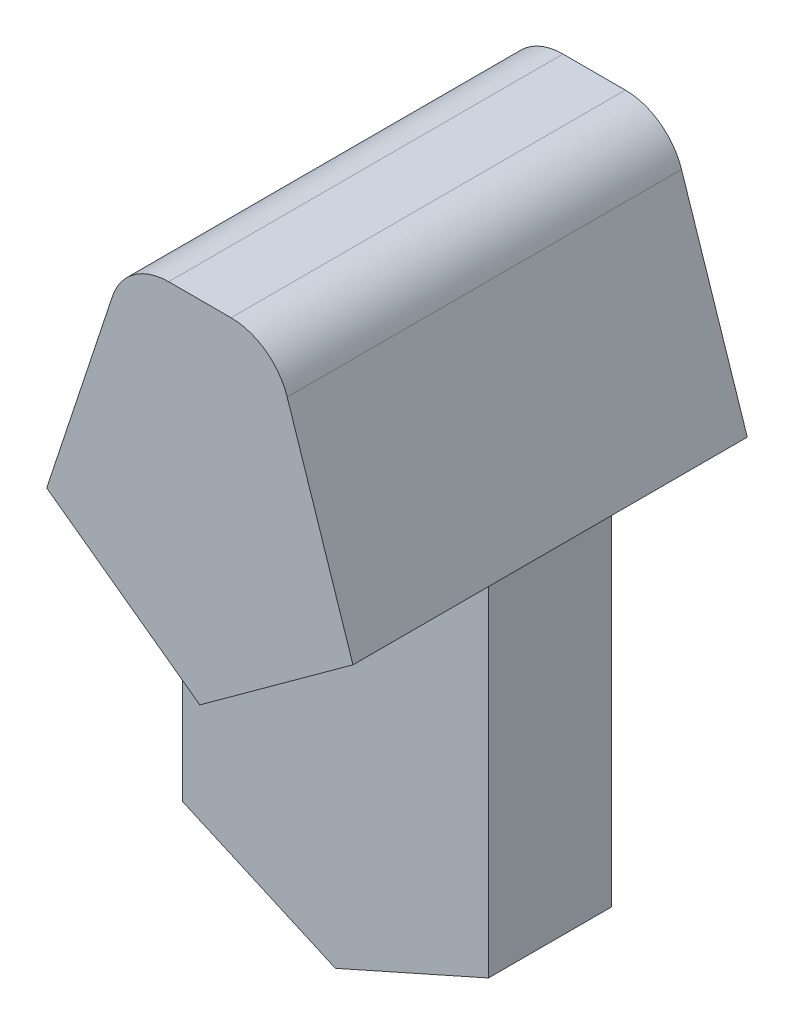
ISO-10303-21;
HEADER;
FILE_DESCRIPTION(('STEP AP214'),'2;1');
FILE_NAME('part.step','',(''),(''),'','','');
FILE_SCHEMA(('AUTOMOTIVE_DESIGN { 1 0 10303 214 1 1 1 1 }'));
ENDSEC;
DATA;
#1=APPLICATION_CONTEXT('core data for automotive mechanical design processes');
#2=APPLICATION_PROTOCOL_DEFINITION('international standard','automotive_design',2000,#1);
#3=PRODUCT_CONTEXT('',#1,'mechanical');
#4=PRODUCT('Part','Part','',(#3));
#5=PRODUCT_RELATED_PRODUCT_CATEGORY('part','',(#4));
#6=PRODUCT_DEFINITION_FORMATION('','',#4);
#7=PRODUCT_DEFINITION_CONTEXT('part definition',#1,'design');
#8=PRODUCT_DEFINITION('design','',#6,#7);
#9=PRODUCT_DEFINITION_SHAPE('','',#8);
#10=(LENGTH_UNIT() NAMED_UNIT(*) SI_UNIT(.MILLI.,.METRE.));
#11=(NAMED_UNIT(*) PLANE_ANGLE_UNIT() SI_UNIT($,.RADIAN.));
#12=(NAMED_UNIT(*) SI_UNIT($,.STERADIAN.) SOLID_ANGLE_UNIT());
#13=UNCERTAINTY_MEASURE_WITH_UNIT(LENGTH_MEASURE(1.E-05),#10,'distance_accuracy_value','');
#14=(GEOMETRIC_REPRESENTATION_CONTEXT(3) GLOBAL_UNCERTAINTY_ASSIGNED_CONTEXT((#13)) GLOBAL_UNIT_ASSIGNED_CONTEXT((#10,
#11,#12)) REPRESENTATION_CONTEXT('',''));
#15=CARTESIAN_POINT('',(0.,0.,0.));
#16=DIRECTION('',(0.,0.,1.));
#17=DIRECTION('',(1.,0.,0.));
#18=AXIS2_PLACEMENT_3D('',#15,#16,#17);
#19=CARTESIAN_POINT('',(0.,-9.525,0.));
#20=DIRECTION('',(0.,1.,0.));
#21=DIRECTION('',(-1.,0.,0.));
#22=AXIS2_PLACEMENT_3D('',#19,#20,#21);
#23=PLANE('',#22);
#24=DIRECTION('',(-1.,0.,0.));
#25=VECTOR('',#24,1.);
#26=CARTESIAN_POINT('',(2.03199999999995,-9.525,5.7912));
#27=LINE('',#26,#25);
#28=CARTESIAN_POINT('',(0.0117675977095557,-9.525,5.7912));
#29=VERTEX_POINT('',#28);
#30=CARTESIAN_POINT('',(-0.0117675977097005,-9.525,5.7912));
#31=VERTEX_POINT('',#30);
#32=EDGE_CURVE('E205',#29,#31,#27,.T.);
#33=ORIENTED_EDGE('',*,*,#32,.T.);
#34=DIRECTION('',(0.,0.,-1.));
#35=VECTOR('',#34,1.);
#36=CARTESIAN_POINT('',(-0.0117675977097005,-9.525,0.));
#37=LINE('',#36,#35);
#38=CARTESIAN_POINT('',(-0.0117675977097005,-9.525,4.365625));
#39=VERTEX_POINT('',#38);
#40=EDGE_CURVE('E364',#31,#39,#37,.T.);
#41=ORIENTED_EDGE('',*,*,#40,.T.);
#42=DIRECTION('',(1.,0.,0.));
#43=VECTOR('',#42,1.);
#44=CARTESIAN_POINT('',(-4.93176759770971,-9.52499999999997,4.365625));
#45=LINE('',#44,#43);
#46=CARTESIAN_POINT('',(0.0117675977095548,-9.525,4.365625));
#47=VERTEX_POINT('',#46);
#48=EDGE_CURVE('E253',#39,#47,#45,.T.);
#49=ORIENTED_EDGE('',*,*,#48,.T.);
#50=DIRECTION('',(0.,0.,1.));
#51=VECTOR('',#50,1.);
#52=CARTESIAN_POINT('',(0.011767597709555,-9.525,8.334375));
#53=LINE('',#52,#51);
#54=EDGE_CURVE('E370',#47,#29,#53,.T.);
#55=ORIENTED_EDGE('',*,*,#54,.T.);
#56=EDGE_LOOP('',(#33,#41,#49,#55));
#57=FACE_BOUND('',#56,.T.);
#58=ADVANCED_FACE('F41',(#57),#23,.F.);
#59=CARTESIAN_POINT('',(4.9317675977096,-7.33447486828204,8.334375));
#60=DIRECTION('',(0.406736643075792,-0.913545457642605,0.));
#61=DIRECTION('',(0.,0.,1.));
#62=AXIS2_PLACEMENT_3D('',#59,#60,#61);
#63=PLANE('',#62);
#64=DIRECTION('',(0.,0.,1.));
#65=VECTOR('',#64,1.);
#66=CARTESIAN_POINT('',(2.03199999999995,-8.62553458351056,8.334375));
#67=LINE('',#66,#65);
#68=CARTESIAN_POINT('',(2.03199999999995,-8.62553458351056,5.7912));
#69=VERTEX_POINT('',#68);
#70=CARTESIAN_POINT('',(2.03199999999995,-8.62553458351056,6.9088));
#71=VERTEX_POINT('',#70);
#72=EDGE_CURVE('E11',#69,#71,#67,.T.);
#73=ORIENTED_EDGE('',*,*,#72,.F.);
#74=DIRECTION('',(-0.913545457642605,-0.406736643075792,0.));
#75=VECTOR('',#74,1.);
#76=CARTESIAN_POINT('',(4.9317675977096,-7.33447486828204,5.7912));
#77=LINE('',#76,#75);
#78=EDGE_CURVE('E229',#69,#29,#77,.T.);
#79=ORIENTED_EDGE('',*,*,#78,.T.);
#80=ORIENTED_EDGE('',*,*,#54,.F.);
#81=DIRECTION('',(-0.913545457642605,-0.406736643075792,0.));
#82=VECTOR('',#81,1.);
#83=CARTESIAN_POINT('',(4.9317675977096,-7.33447486828204,4.365625));
#84=LINE('',#83,#82);
#85=CARTESIAN_POINT('',(4.9317675977096,-7.33447486828204,4.365625));
#86=VERTEX_POINT('',#85);
#87=EDGE_CURVE('E361',#86,#47,#84,.T.);
#88=ORIENTED_EDGE('',*,*,#87,.F.);
#89=DIRECTION('',(0.,0.,-1.));
#90=VECTOR('',#89,1.);
#91=CARTESIAN_POINT('',(4.9317675977096,-7.33447486828204,4.365625));
#92=LINE('',#91,#90);
#93=CARTESIAN_POINT('',(4.9317675977096,-7.33447486828204,8.334375));
#94=VERTEX_POINT('',#93);
#95=EDGE_CURVE('E354',#94,#86,#92,.T.);
#96=ORIENTED_EDGE('',*,*,#95,.F.);
#97=DIRECTION('',(0.913545457642605,0.406736643075792,0.));
#98=VECTOR('',#97,1.);
#99=CARTESIAN_POINT('',(-4.11393535143373,-11.3618813000206,8.334375));
#100=LINE('',#99,#98);
#101=CARTESIAN_POINT('',(0.0117675977095548,-9.525,8.334375));
#102=VERTEX_POINT('',#101);
#103=EDGE_CURVE('E377',#102,#94,#100,.T.);
#104=ORIENTED_EDGE('',*,*,#103,.F.);
#105=CARTESIAN_POINT('',(0.0117675977095557,-9.525,6.9088));
#106=VERTEX_POINT('',#105);
#107=EDGE_CURVE('E369',#106,#102,#53,.T.);
#108=ORIENTED_EDGE('',*,*,#107,.F.);
#109=DIRECTION('',(-0.913545457642605,-0.406736643075792,0.));
#110=VECTOR('',#109,1.);
#111=CARTESIAN_POINT('',(4.9317675977096,-7.33447486828204,6.9088));
#112=LINE('',#111,#110);
#113=EDGE_CURVE('E220',#71,#106,#112,.T.);
#114=ORIENTED_EDGE('',*,*,#113,.F.);
#115=EDGE_LOOP('',(#73,#79,#80,#88,#96,#104,#108,#114));
#116=FACE_BOUND('',#115,.T.);
#117=ADVANCED_FACE('F400',(#116),#63,.T.);
#118=CARTESIAN_POINT('',(-0.0117675977097005,-9.525,0.));
#119=DIRECTION('',(0.406736643075813,0.913545457642595,0.));
#120=DIRECTION('',(0.,0.,-1.));
#121=AXIS2_PLACEMENT_3D('',#118,#119,#120);
#122=PLANE('',#121);
#123=ORIENTED_EDGE('',*,*,#40,.F.);
#124=DIRECTION('',(0.913545457642595,-0.406736643075813,0.));
#125=VECTOR('',#124,1.);
#126=CARTESIAN_POINT('',(-0.0117675977097005,-9.525,5.7912));
#127=LINE('',#126,#125);
#128=CARTESIAN_POINT('',(-2.03200000000005,-8.62553458351053,5.7912));
#129=VERTEX_POINT('',#128);
#130=EDGE_CURVE('E51',#31,#129,#127,.F.);
#131=ORIENTED_EDGE('',*,*,#130,.T.);
#132=DIRECTION('',(0.,0.,-1.));
#133=VECTOR('',#132,1.);
#134=CARTESIAN_POINT('',(-2.03200000000005,-8.62553458351053,0.));
#135=LINE('',#134,#133);
#136=CARTESIAN_POINT('',(-2.03200000000005,-8.62553458351053,6.9088));
#137=VERTEX_POINT('',#136);
#138=EDGE_CURVE('E385',#129,#137,#135,.F.);
#139=ORIENTED_EDGE('',*,*,#138,.T.);
#140=DIRECTION('',(0.913545457642595,-0.406736643075813,0.));
#141=VECTOR('',#140,1.);
#142=CARTESIAN_POINT('',(-0.0117675977097005,-9.525,6.9088));
#143=LINE('',#142,#141);
#144=CARTESIAN_POINT('',(-0.0117675977097005,-9.525,6.9088));
#145=VERTEX_POINT('',#144);
#146=EDGE_CURVE('E382',#145,#137,#143,.F.);
#147=ORIENTED_EDGE('',*,*,#146,.F.);
#148=CARTESIAN_POINT('',(-0.0117675977097005,-9.525,8.334375));
#149=VERTEX_POINT('',#148);
#150=EDGE_CURVE('E365',#149,#145,#37,.T.);
#151=ORIENTED_EDGE('',*,*,#150,.F.);
#152=DIRECTION('',(-0.913545457642595,0.406736643075813,0.));
#153=VECTOR('',#152,1.);
#154=CARTESIAN_POINT('',(-4.11782888935246,-7.69686372932555,8.334375));
#155=LINE('',#154,#153);
#156=CARTESIAN_POINT('',(-4.9317675977097,-7.33447486828192,8.334375));
#157=VERTEX_POINT('',#156);
#158=EDGE_CURVE('E374',#157,#149,#155,.F.);
#159=ORIENTED_EDGE('',*,*,#158,.F.);
#160=DIRECTION('',(0.,0.,1.));
#161=VECTOR('',#160,1.);
#162=CARTESIAN_POINT('',(-4.9317675977097,-7.33447486828192,8.334375));
#163=LINE('',#162,#161);
#164=CARTESIAN_POINT('',(-4.9317675977097,-7.33447486828192,4.365625));
#165=VERTEX_POINT('',#164);
#166=EDGE_CURVE('E66',#165,#157,#163,.T.);
#167=ORIENTED_EDGE('',*,*,#166,.F.);
#168=DIRECTION('',(0.913545457642595,-0.406736643075813,0.));
#169=VECTOR('',#168,1.);
#170=CARTESIAN_POINT('',(-0.0117675977097005,-9.525,4.365625));
#171=LINE('',#170,#169);
#172=EDGE_CURVE('E358',#39,#165,#171,.F.);
#173=ORIENTED_EDGE('',*,*,#172,.F.);
#174=EDGE_LOOP('',(#123,#131,#139,#147,#151,#159,#167,#173));
#175=FACE_BOUND('',#174,.T.);
#176=ADVANCED_FACE('F44',(#175),#122,.F.);
#177=CARTESIAN_POINT('',(4.93176759770967,3.58313889797493,12.7));
#178=DIRECTION('',(-0.587785252292475,0.809016994374946,0.));
#179=DIRECTION('',(-0.809016994374946,-0.587785252292475,0.));
#180=AXIS2_PLACEMENT_3D('',#177,#178,#179);
#181=PLANE('',#180);
#182=DIRECTION('',(0.809016994374946,0.587785252292475,0.));
#183=VECTOR('',#182,1.);
#184=CARTESIAN_POINT('',(2.14682306618461,1.559758257686,4.365625));
#185=LINE('',#184,#183);
#186=CARTESIAN_POINT('',(0.,0.,4.365625));
#187=VERTEX_POINT('',#186);
#188=CARTESIAN_POINT('',(4.93176759770967,3.58313889797493,4.365625));
#189=VERTEX_POINT('',#188);
#190=EDGE_CURVE('E238',#187,#189,#185,.T.);
#191=ORIENTED_EDGE('',*,*,#190,.F.);
#192=DIRECTION('',(0.,0.,-1.));
#193=VECTOR('',#192,1.);
#194=CARTESIAN_POINT('',(0.,0.,12.7));
#195=LINE('',#194,#193);
#196=CARTESIAN_POINT('',(0.,0.,0.));
#197=VERTEX_POINT('',#196);
#198=EDGE_CURVE('E296',#187,#197,#195,.T.);
#199=ORIENTED_EDGE('',*,*,#198,.T.);
#200=DIRECTION('',(0.809016994374946,0.587785252292475,0.));
#201=VECTOR('',#200,1.);
#202=CARTESIAN_POINT('',(4.93176759770967,3.58313889797493,0.));
#203=LINE('',#202,#201);
#204=CARTESIAN_POINT('',(4.93176759770967,3.58313889797493,0.));
#205=VERTEX_POINT('',#204);
#206=EDGE_CURVE('E276',#197,#205,#203,.T.);
#207=ORIENTED_EDGE('',*,*,#206,.T.);
#208=DIRECTION('',(0.,0.,-1.));
#209=VECTOR('',#208,1.);
#210=CARTESIAN_POINT('',(4.93176759770967,3.58313889797493,12.7));
#211=LINE('',#210,#209);
#212=EDGE_CURVE('E323',#189,#205,#211,.T.);
#213=ORIENTED_EDGE('',*,*,#212,.F.);
#214=EDGE_LOOP('',(#191,#199,#207,#213));
#215=FACE_BOUND('',#214,.T.);
#216=ADVANCED_FACE('F482',(#215),#181,.F.);
#217=CARTESIAN_POINT('',(0.,0.,12.7));
#218=DIRECTION('',(0.587785252292475,0.809016994374946,0.));
#219=DIRECTION('',(-0.809016994374946,0.587785252292475,0.));
#220=AXIS2_PLACEMENT_3D('',#217,#218,#219);
#221=PLANE('',#220);
#222=DIRECTION('',(0.809016994374946,-0.587785252292475,0.));
#223=VECTOR('',#222,1.);
#224=CARTESIAN_POINT('',(-8.60259066389412,6.25014796834098,4.365625));
#225=LINE('',#224,#223);
#226=CARTESIAN_POINT('',(-4.93176759770962,3.58313889797489,4.365625));
#227=VERTEX_POINT('',#226);
#228=EDGE_CURVE('E234',#227,#187,#225,.T.);
#229=ORIENTED_EDGE('',*,*,#228,.F.);
#230=DIRECTION('',(0.,0.,-1.));
#231=VECTOR('',#230,1.);
#232=CARTESIAN_POINT('',(-4.93176759770967,3.58313889797493,12.7));
#233=LINE('',#232,#231);
#234=CARTESIAN_POINT('',(-4.93176759770967,3.58313889797493,0.));
#235=VERTEX_POINT('',#234);
#236=EDGE_CURVE('E318',#227,#235,#233,.T.);
#237=ORIENTED_EDGE('',*,*,#236,.T.);
#238=DIRECTION('',(0.809016994374946,-0.587785252292475,0.));
#239=VECTOR('',#238,1.);
#240=CARTESIAN_POINT('',(0.,0.,0.));
#241=LINE('',#240,#239);
#242=EDGE_CURVE('E282',#235,#197,#241,.T.);
#243=ORIENTED_EDGE('',*,*,#242,.T.);
#244=ORIENTED_EDGE('',*,*,#198,.F.);
#245=EDGE_LOOP('',(#229,#237,#243,#244));
#246=FACE_BOUND('',#245,.T.);
#247=ADVANCED_FACE('F484',(#246),#221,.F.);
#248=CARTESIAN_POINT('',(0.,0.,12.7));
#249=VERTEX_POINT('',#248);
#250=CARTESIAN_POINT('',(0.,0.,8.334375));
#251=VERTEX_POINT('',#250);
#252=EDGE_CURVE('E314',#249,#251,#195,.T.);
#253=ORIENTED_EDGE('',*,*,#252,.T.);
#254=DIRECTION('',(0.809016994374946,0.587785252292475,0.));
#255=VECTOR('',#254,1.);
#256=CARTESIAN_POINT('',(2.14682306618461,1.559758257686,8.334375));
#257=LINE('',#256,#255);
#258=CARTESIAN_POINT('',(4.93176759770967,3.58313889797493,8.334375));
#259=VERTEX_POINT('',#258);
#260=EDGE_CURVE('E249',#251,#259,#257,.T.);
#261=ORIENTED_EDGE('',*,*,#260,.T.);
#262=CARTESIAN_POINT('',(4.93176759770967,3.58313889797493,12.7));
#263=VERTEX_POINT('',#262);
#264=EDGE_CURVE('E324',#263,#259,#211,.T.);
#265=ORIENTED_EDGE('',*,*,#264,.F.);
#266=DIRECTION('',(0.809016994374946,0.587785252292475,0.));
#267=VECTOR('',#266,1.);
#268=CARTESIAN_POINT('',(4.93176759770967,3.58313889797493,12.7));
#269=LINE('',#268,#267);
#270=EDGE_CURVE('E277',#249,#263,#269,.T.);
#271=ORIENTED_EDGE('',*,*,#270,.F.);
#272=EDGE_LOOP('',(#253,#261,#265,#271));
#273=FACE_BOUND('',#272,.T.);
#274=ADVANCED_FACE('F492',(#273),#181,.F.);
#275=CARTESIAN_POINT('',(2.38125,11.3006024698859,12.7));
#276=DIRECTION('',(-0.949491089063853,-0.31379399578121,0.));
#277=DIRECTION('',(0.31379399578121,-0.949491089063853,0.));
#278=AXIS2_PLACEMENT_3D('',#275,#276,#277);
#279=PLANE('',#278);
#280=DIRECTION('',(-0.31379399578121,0.949491089063853,0.));
#281=VECTOR('',#280,1.);
#282=CARTESIAN_POINT('',(2.38125,11.3006024698859,0.));
#283=LINE('',#282,#281);
#284=CARTESIAN_POINT('',(2.8132693806251,9.99338003184913,0.));
#285=VERTEX_POINT('',#284);
#286=EDGE_CURVE('E300',#205,#285,#283,.T.);
#287=ORIENTED_EDGE('',*,*,#286,.T.);
#288=DIRECTION('',(0.,0.,-1.));
#289=VECTOR('',#288,1.);
#290=CARTESIAN_POINT('',(2.8132693806251,9.99338003184913,12.7));
#291=LINE('',#290,#289);
#292=CARTESIAN_POINT('',(2.8132693806251,9.99338003184913,12.7));
#293=VERTEX_POINT('',#292);
#294=EDGE_CURVE('E351',#285,#293,#291,.F.);
#295=ORIENTED_EDGE('',*,*,#294,.T.);
#296=DIRECTION('',(-0.31379399578121,0.949491089063853,0.));
#297=VECTOR('',#296,1.);
#298=CARTESIAN_POINT('',(2.38125,11.3006024698859,12.7));
#299=LINE('',#298,#297);
#300=EDGE_CURVE('E281',#263,#293,#299,.T.);
#301=ORIENTED_EDGE('',*,*,#300,.F.);
#302=ORIENTED_EDGE('',*,*,#264,.T.);
#303=DIRECTION('',(0.,0.,-1.));
#304=VECTOR('',#303,1.);
#305=CARTESIAN_POINT('',(4.93176759770967,3.58313889797493,8.334375));
#306=LINE('',#305,#304);
#307=EDGE_CURVE('E245',#259,#189,#306,.T.);
#308=ORIENTED_EDGE('',*,*,#307,.T.);
#309=ORIENTED_EDGE('',*,*,#212,.T.);
#310=EDGE_LOOP('',(#287,#295,#301,#302,#308,#309));
#311=FACE_BOUND('',#310,.T.);
#312=ADVANCED_FACE('F474',(#311),#279,.F.);
#313=CARTESIAN_POINT('',(-2.38125,11.3006024698859,12.7));
#314=DIRECTION('',(0.,-1.,0.));
#315=DIRECTION('',(0.,0.,-1.));
#316=AXIS2_PLACEMENT_3D('',#313,#314,#315);
#317=PLANE('',#316);
#318=DIRECTION('',(-1.,0.,0.));
#319=VECTOR('',#318,1.);
#320=CARTESIAN_POINT('',(-2.38125,11.3006024698859,0.));
#321=LINE('',#320,#319);
#322=CARTESIAN_POINT('',(1.00448885595846,11.3006024698859,0.));
#323=VERTEX_POINT('',#322);
#324=CARTESIAN_POINT('',(-1.00448885595846,11.3006024698859,0.));
#325=VERTEX_POINT('',#324);
#326=EDGE_CURVE('E304',#323,#325,#321,.T.);
#327=ORIENTED_EDGE('',*,*,#326,.T.);
#328=DIRECTION('',(0.,0.,-1.));
#329=VECTOR('',#328,1.);
#330=CARTESIAN_POINT('',(-1.00448885595846,11.3006024698859,12.7));
#331=LINE('',#330,#329);
#332=CARTESIAN_POINT('',(-1.00448885595846,11.3006024698859,12.7));
#333=VERTEX_POINT('',#332);
#334=EDGE_CURVE('E342',#325,#333,#331,.F.);
#335=ORIENTED_EDGE('',*,*,#334,.T.);
#336=DIRECTION('',(-1.,0.,0.));
#337=VECTOR('',#336,1.);
#338=CARTESIAN_POINT('',(-2.38125,11.3006024698859,12.7));
#339=LINE('',#338,#337);
#340=CARTESIAN_POINT('',(1.00448885595846,11.3006024698859,12.7));
#341=VERTEX_POINT('',#340);
#342=EDGE_CURVE('E286',#341,#333,#339,.T.);
#343=ORIENTED_EDGE('',*,*,#342,.F.);
#344=DIRECTION('',(0.,0.,-1.));
#345=VECTOR('',#344,1.);
#346=CARTESIAN_POINT('',(1.00448885595846,11.3006024698859,12.7));
#347=LINE('',#346,#345);
#348=EDGE_CURVE('E338',#341,#323,#347,.T.);
#349=ORIENTED_EDGE('',*,*,#348,.T.);
#350=EDGE_LOOP('',(#327,#335,#343,#349));
#351=FACE_BOUND('',#350,.T.);
#352=ADVANCED_FACE('F465',(#351),#317,.F.);
#353=CARTESIAN_POINT('',(-4.93176759770967,3.58313889797493,12.7));
#354=DIRECTION('',(0.949491089063853,-0.31379399578121,0.));
#355=DIRECTION('',(0.31379399578121,0.949491089063853,0.));
#356=AXIS2_PLACEMENT_3D('',#353,#354,#355);
#357=PLANE('',#356);
#358=DIRECTION('',(-0.31379399578121,-0.949491089063853,0.));
#359=VECTOR('',#358,1.);
#360=CARTESIAN_POINT('',(-4.93176759770967,3.58313889797493,12.7));
#361=LINE('',#360,#359);
#362=CARTESIAN_POINT('',(-2.8132693806251,9.99338003184913,12.7));
#363=VERTEX_POINT('',#362);
#364=CARTESIAN_POINT('',(-4.93176759770967,3.58313889797493,12.7));
#365=VERTEX_POINT('',#364);
#366=EDGE_CURVE('E290',#363,#365,#361,.T.);
#367=ORIENTED_EDGE('',*,*,#366,.F.);
#368=DIRECTION('',(0.,0.,-1.));
#369=VECTOR('',#368,1.);
#370=CARTESIAN_POINT('',(-2.8132693806251,9.99338003184913,12.7));
#371=LINE('',#370,#369);
#372=CARTESIAN_POINT('',(-2.8132693806251,9.99338003184913,0.));
#373=VERTEX_POINT('',#372);
#374=EDGE_CURVE('E328',#363,#373,#371,.T.);
#375=ORIENTED_EDGE('',*,*,#374,.T.);
#376=DIRECTION('',(-0.31379399578121,-0.949491089063853,0.));
#377=VECTOR('',#376,1.);
#378=CARTESIAN_POINT('',(-4.93176759770967,3.58313889797493,0.));
#379=LINE('',#378,#377);
#380=EDGE_CURVE('E308',#373,#235,#379,.T.);
#381=ORIENTED_EDGE('',*,*,#380,.T.);
#382=ORIENTED_EDGE('',*,*,#236,.F.);
#383=DIRECTION('',(0.,0.,-1.));
#384=VECTOR('',#383,1.);
#385=CARTESIAN_POINT('',(-4.93176759770962,3.58313889797489,8.334375));
#386=LINE('',#385,#384);
#387=CARTESIAN_POINT('',(-4.93176759770967,3.58313889797493,8.334375));
#388=VERTEX_POINT('',#387);
#389=EDGE_CURVE('E239',#388,#227,#386,.T.);
#390=ORIENTED_EDGE('',*,*,#389,.F.);
#391=EDGE_CURVE('E319',#365,#388,#233,.T.);
#392=ORIENTED_EDGE('',*,*,#391,.F.);
#393=EDGE_LOOP('',(#367,#375,#381,#382,#390,#392));
#394=FACE_BOUND('',#393,.T.);
#395=ADVANCED_FACE('F445',(#394),#357,.F.);
#396=ORIENTED_EDGE('',*,*,#391,.T.);
#397=DIRECTION('',(0.809016994374946,-0.587785252292475,0.));
#398=VECTOR('',#397,1.);
#399=CARTESIAN_POINT('',(-8.60259066389412,6.25014796834098,8.334375));
#400=LINE('',#399,#398);
#401=EDGE_CURVE('E233',#388,#251,#400,.T.);
#402=ORIENTED_EDGE('',*,*,#401,.T.);
#403=ORIENTED_EDGE('',*,*,#252,.F.);
#404=DIRECTION('',(0.809016994374946,-0.587785252292475,0.));
#405=VECTOR('',#404,1.);
#406=CARTESIAN_POINT('',(0.,0.,12.7));
#407=LINE('',#406,#405);
#408=EDGE_CURVE('E293',#365,#249,#407,.T.);
#409=ORIENTED_EDGE('',*,*,#408,.F.);
#410=EDGE_LOOP('',(#396,#402,#403,#409));
#411=FACE_BOUND('',#410,.T.);
#412=ADVANCED_FACE('F450',(#411),#221,.F.);
#413=CARTESIAN_POINT('',(0.,0.,12.7));
#414=DIRECTION('',(0.,0.,1.));
#415=DIRECTION('',(1.,0.,0.));
#416=AXIS2_PLACEMENT_3D('',#413,#414,#415);
#417=PLANE('',#416);
#418=ORIENTED_EDGE('',*,*,#342,.T.);
#419=CARTESIAN_POINT('',(-1.00448885595846,9.39560246988592,12.7));
#420=DIRECTION('',(0.,0.,1.));
#421=DIRECTION('',(1.,0.,0.));
#422=AXIS2_PLACEMENT_3D('',#419,#420,#421);
#423=CIRCLE('',#422,1.905);
#424=EDGE_CURVE('E348',#333,#363,#423,.T.);
#425=ORIENTED_EDGE('',*,*,#424,.T.);
#426=ORIENTED_EDGE('',*,*,#366,.T.);
#427=ORIENTED_EDGE('',*,*,#408,.T.);
#428=ORIENTED_EDGE('',*,*,#270,.T.);
#429=ORIENTED_EDGE('',*,*,#300,.T.);
#430=CARTESIAN_POINT('',(1.00448885595846,9.39560246988592,12.7));
#431=DIRECTION('',(0.,0.,1.));
#432=DIRECTION('',(1.,0.,0.));
#433=AXIS2_PLACEMENT_3D('',#430,#431,#432);
#434=CIRCLE('',#433,1.905);
#435=EDGE_CURVE('E345',#293,#341,#434,.T.);
#436=ORIENTED_EDGE('',*,*,#435,.T.);
#437=EDGE_LOOP('',(#418,#425,#426,#427,#428,#429,#436));
#438=FACE_BOUND('',#437,.T.);
#439=ADVANCED_FACE('F454',(#438),#417,.T.);
#440=CARTESIAN_POINT('',(0.,0.,0.));
#441=DIRECTION('',(0.,0.,1.));
#442=DIRECTION('',(1.,0.,0.));
#443=AXIS2_PLACEMENT_3D('',#440,#441,#442);
#444=PLANE('',#443);
#445=ORIENTED_EDGE('',*,*,#380,.F.);
#446=CARTESIAN_POINT('',(-1.00448885595846,9.39560246988592,0.));
#447=DIRECTION('',(0.,0.,1.));
#448=DIRECTION('',(1.,0.,0.));
#449=AXIS2_PLACEMENT_3D('',#446,#447,#448);
#450=CIRCLE('',#449,1.905);
#451=EDGE_CURVE('E335',#373,#325,#450,.F.);
#452=ORIENTED_EDGE('',*,*,#451,.T.);
#453=ORIENTED_EDGE('',*,*,#326,.F.);
#454=CARTESIAN_POINT('',(1.00448885595846,9.39560246988592,0.));
#455=DIRECTION('',(0.,0.,1.));
#456=DIRECTION('',(1.,0.,0.));
#457=AXIS2_PLACEMENT_3D('',#454,#455,#456);
#458=CIRCLE('',#457,1.905);
#459=EDGE_CURVE('E332',#323,#285,#458,.F.);
#460=ORIENTED_EDGE('',*,*,#459,.T.);
#461=ORIENTED_EDGE('',*,*,#286,.F.);
#462=ORIENTED_EDGE('',*,*,#206,.F.);
#463=ORIENTED_EDGE('',*,*,#242,.F.);
#464=EDGE_LOOP('',(#445,#452,#453,#460,#461,#462,#463));
#465=FACE_BOUND('',#464,.T.);
#466=ADVANCED_FACE('F462',(#465),#444,.F.);
#467=CARTESIAN_POINT('',(-4.93176759770971,-9.52499999999997,4.365625));
#468=DIRECTION('',(0.,0.,1.));
#469=DIRECTION('',(1.,0.,0.));
#470=AXIS2_PLACEMENT_3D('',#467,#468,#469);
#471=PLANE('',#470);
#472=DIRECTION('',(0.,1.,0.));
#473=VECTOR('',#472,1.);
#474=CARTESIAN_POINT('',(4.93176759770958,-9.52500000000004,4.365625));
#475=LINE('',#474,#473);
#476=EDGE_CURVE('E273',#86,#189,#475,.T.);
#477=ORIENTED_EDGE('',*,*,#476,.F.);
#478=ORIENTED_EDGE('',*,*,#87,.T.);
#479=ORIENTED_EDGE('',*,*,#48,.F.);
#480=ORIENTED_EDGE('',*,*,#172,.T.);
#481=DIRECTION('',(0.,1.,0.));
#482=VECTOR('',#481,1.);
#483=CARTESIAN_POINT('',(-4.93176759770971,-9.52499999999997,4.365625));
#484=LINE('',#483,#482);
#485=EDGE_CURVE('E264',#165,#227,#484,.T.);
#486=ORIENTED_EDGE('',*,*,#485,.T.);
#487=ORIENTED_EDGE('',*,*,#228,.T.);
#488=ORIENTED_EDGE('',*,*,#190,.T.);
#489=EDGE_LOOP('',(#477,#478,#479,#480,#486,#487,#488));
#490=FACE_BOUND('',#489,.T.);
#491=ADVANCED_FACE('F487',(#490),#471,.F.);
#492=CARTESIAN_POINT('',(4.93176759770958,-9.52500000000004,8.334375));
#493=DIRECTION('',(1.,0.,0.));
#494=DIRECTION('',(0.,1.,0.));
#495=AXIS2_PLACEMENT_3D('',#492,#493,#494);
#496=PLANE('',#495);
#497=DIRECTION('',(0.,1.,0.));
#498=VECTOR('',#497,1.);
#499=CARTESIAN_POINT('',(4.93176759770958,-9.52500000000004,8.334375));
#500=LINE('',#499,#498);
#501=EDGE_CURVE('E270',#94,#259,#500,.T.);
#502=ORIENTED_EDGE('',*,*,#501,.F.);
#503=ORIENTED_EDGE('',*,*,#95,.T.);
#504=ORIENTED_EDGE('',*,*,#476,.T.);
#505=ORIENTED_EDGE('',*,*,#307,.F.);
#506=EDGE_LOOP('',(#502,#503,#504,#505));
#507=FACE_BOUND('',#506,.T.);
#508=ADVANCED_FACE('F490',(#507),#496,.T.);
#509=CARTESIAN_POINT('',(-4.93176759770971,-9.52499999999997,8.334375));
#510=DIRECTION('',(0.,0.,1.));
#511=DIRECTION('',(1.,0.,0.));
#512=AXIS2_PLACEMENT_3D('',#509,#510,#511);
#513=PLANE('',#512);
#514=DIRECTION('',(1.,0.,0.));
#515=VECTOR('',#514,1.);
#516=CARTESIAN_POINT('',(-4.93176759770971,-9.52499999999997,8.334375));
#517=LINE('',#516,#515);
#518=EDGE_CURVE('E260',#149,#102,#517,.T.);
#519=ORIENTED_EDGE('',*,*,#518,.T.);
#520=ORIENTED_EDGE('',*,*,#103,.T.);
#521=ORIENTED_EDGE('',*,*,#501,.T.);
#522=ORIENTED_EDGE('',*,*,#260,.F.);
#523=ORIENTED_EDGE('',*,*,#401,.F.);
#524=DIRECTION('',(0.,1.,0.));
#525=VECTOR('',#524,1.);
#526=CARTESIAN_POINT('',(-4.93176759770971,-9.52499999999997,8.334375));
#527=LINE('',#526,#525);
#528=EDGE_CURVE('E267',#157,#388,#527,.T.);
#529=ORIENTED_EDGE('',*,*,#528,.F.);
#530=ORIENTED_EDGE('',*,*,#158,.T.);
#531=EDGE_LOOP('',(#519,#520,#521,#522,#523,#529,#530));
#532=FACE_BOUND('',#531,.T.);
#533=ADVANCED_FACE('F431',(#532),#513,.T.);
#534=CARTESIAN_POINT('',(-4.93176759770971,-9.52499999999997,8.334375));
#535=DIRECTION('',(1.,0.,0.));
#536=DIRECTION('',(0.,1.,0.));
#537=AXIS2_PLACEMENT_3D('',#534,#535,#536);
#538=PLANE('',#537);
#539=ORIENTED_EDGE('',*,*,#485,.F.);
#540=ORIENTED_EDGE('',*,*,#166,.T.);
#541=ORIENTED_EDGE('',*,*,#528,.T.);
#542=ORIENTED_EDGE('',*,*,#389,.T.);
#543=EDGE_LOOP('',(#539,#540,#541,#542));
#544=FACE_BOUND('',#543,.T.);
#545=ADVANCED_FACE('F422',(#544),#538,.F.);
#546=ORIENTED_EDGE('',*,*,#150,.T.);
#547=DIRECTION('',(-1.,0.,0.));
#548=VECTOR('',#547,1.);
#549=CARTESIAN_POINT('',(2.03199999999995,-9.525,6.9088));
#550=LINE('',#549,#548);
#551=EDGE_CURVE('E58',#106,#145,#550,.T.);
#552=ORIENTED_EDGE('',*,*,#551,.F.);
#553=ORIENTED_EDGE('',*,*,#107,.T.);
#554=ORIENTED_EDGE('',*,*,#518,.F.);
#555=EDGE_LOOP('',(#546,#552,#553,#554));
#556=FACE_BOUND('',#555,.T.);
#557=ADVANCED_FACE('F414',(#556),#23,.F.);
#558=CARTESIAN_POINT('',(-1.00448885595846,9.39560246988592,12.7));
#559=DIRECTION('',(0.,0.,-1.));
#560=DIRECTION('',(-1.,0.,0.));
#561=AXIS2_PLACEMENT_3D('',#558,#559,#560);
#562=CYLINDRICAL_SURFACE('',#561,1.905);
#563=ORIENTED_EDGE('',*,*,#424,.F.);
#564=ORIENTED_EDGE('',*,*,#334,.F.);
#565=ORIENTED_EDGE('',*,*,#451,.F.);
#566=ORIENTED_EDGE('',*,*,#374,.F.);
#567=EDGE_LOOP('',(#563,#564,#565,#566));
#568=FACE_BOUND('',#567,.T.);
#569=ADVANCED_FACE('F421',(#568),#562,.T.);
#570=CARTESIAN_POINT('',(1.00448885595846,9.39560246988592,12.7));
#571=DIRECTION('',(0.,0.,-1.));
#572=DIRECTION('',(-1.,0.,0.));
#573=AXIS2_PLACEMENT_3D('',#570,#571,#572);
#574=CYLINDRICAL_SURFACE('',#573,1.905);
#575=ORIENTED_EDGE('',*,*,#435,.F.);
#576=ORIENTED_EDGE('',*,*,#294,.F.);
#577=ORIENTED_EDGE('',*,*,#459,.F.);
#578=ORIENTED_EDGE('',*,*,#348,.F.);
#579=EDGE_LOOP('',(#575,#576,#577,#578));
#580=FACE_BOUND('',#579,.T.);
#581=ADVANCED_FACE('F428',(#580),#574,.T.);
#582=CARTESIAN_POINT('',(2.03199999999995,-1.27,5.7912));
#583=DIRECTION('',(1.,0.,0.));
#584=DIRECTION('',(0.,0.,-1.));
#585=AXIS2_PLACEMENT_3D('',#582,#583,#584);
#586=PLANE('',#585);
#587=ORIENTED_EDGE('',*,*,#72,.T.);
#588=DIRECTION('',(0.,-1.,0.));
#589=VECTOR('',#588,1.);
#590=CARTESIAN_POINT('',(2.03199999999995,-1.27,6.9088));
#591=LINE('',#590,#589);
#592=CARTESIAN_POINT('',(2.03199999999995,-1.27,6.9088));
#593=VERTEX_POINT('',#592);
#594=EDGE_CURVE('E180',#593,#71,#591,.T.);
#595=ORIENTED_EDGE('',*,*,#594,.F.);
#596=DIRECTION('',(0.,0.,1.));
#597=VECTOR('',#596,1.);
#598=CARTESIAN_POINT('',(2.03199999999995,-1.27,5.7912));
#599=LINE('',#598,#597);
#600=CARTESIAN_POINT('',(2.03199999999995,-1.27,5.7912));
#601=VERTEX_POINT('',#600);
#602=EDGE_CURVE('E185',#601,#593,#599,.T.);
#603=ORIENTED_EDGE('',*,*,#602,.F.);
#604=DIRECTION('',(0.,-1.,0.));
#605=VECTOR('',#604,1.);
#606=CARTESIAN_POINT('',(2.03199999999995,-1.27,5.7912));
#607=LINE('',#606,#605);
#608=EDGE_CURVE('E217',#601,#69,#607,.T.);
#609=ORIENTED_EDGE('',*,*,#608,.T.);
#610=EDGE_LOOP('',(#587,#595,#603,#609));
#611=FACE_BOUND('',#610,.T.);
#612=ADVANCED_FACE('F182',(#611),#586,.F.);
#613=CARTESIAN_POINT('',(2.03199999999995,-1.27,5.7912));
#614=DIRECTION('',(0.,0.,1.));
#615=DIRECTION('',(1.,0.,0.));
#616=AXIS2_PLACEMENT_3D('',#613,#614,#615);
#617=PLANE('',#616);
#618=ORIENTED_EDGE('',*,*,#608,.F.);
#619=DIRECTION('',(-1.,0.,0.));
#620=VECTOR('',#619,1.);
#621=CARTESIAN_POINT('',(2.03199999999995,-1.27,5.7912));
#622=LINE('',#621,#620);
#623=CARTESIAN_POINT('',(-2.03200000000005,-1.27,5.7912));
#624=VERTEX_POINT('',#623);
#625=EDGE_CURVE('E190',#601,#624,#622,.T.);
#626=ORIENTED_EDGE('',*,*,#625,.T.);
#627=DIRECTION('',(0.,-1.,0.));
#628=VECTOR('',#627,1.);
#629=CARTESIAN_POINT('',(-2.03200000000005,-1.27,5.7912));
#630=LINE('',#629,#628);
#631=EDGE_CURVE('E221',#624,#129,#630,.T.);
#632=ORIENTED_EDGE('',*,*,#631,.T.);
#633=ORIENTED_EDGE('',*,*,#130,.F.);
#634=ORIENTED_EDGE('',*,*,#32,.F.);
#635=ORIENTED_EDGE('',*,*,#78,.F.);
#636=EDGE_LOOP('',(#618,#626,#632,#633,#634,#635));
#637=FACE_BOUND('',#636,.T.);
#638=ADVANCED_FACE('F394',(#637),#617,.T.);
#639=CARTESIAN_POINT('',(-2.03200000000005,-1.27,5.7912));
#640=DIRECTION('',(1.,0.,0.));
#641=DIRECTION('',(0.,0.,-1.));
#642=AXIS2_PLACEMENT_3D('',#639,#640,#641);
#643=PLANE('',#642);
#644=ORIENTED_EDGE('',*,*,#631,.F.);
#645=DIRECTION('',(0.,0.,1.));
#646=VECTOR('',#645,1.);
#647=CARTESIAN_POINT('',(-2.03200000000005,-1.27,5.7912));
#648=LINE('',#647,#646);
#649=CARTESIAN_POINT('',(-2.03200000000005,-1.27,6.9088));
#650=VERTEX_POINT('',#649);
#651=EDGE_CURVE('E200',#624,#650,#648,.T.);
#652=ORIENTED_EDGE('',*,*,#651,.T.);
#653=DIRECTION('',(0.,-1.,0.));
#654=VECTOR('',#653,1.);
#655=CARTESIAN_POINT('',(-2.03200000000005,-1.27,6.9088));
#656=LINE('',#655,#654);
#657=EDGE_CURVE('E189',#650,#137,#656,.T.);
#658=ORIENTED_EDGE('',*,*,#657,.T.);
#659=ORIENTED_EDGE('',*,*,#138,.F.);
#660=EDGE_LOOP('',(#644,#652,#658,#659));
#661=FACE_BOUND('',#660,.T.);
#662=ADVANCED_FACE('F403',(#661),#643,.T.);
#663=CARTESIAN_POINT('',(2.03199999999995,-1.27,6.9088));
#664=DIRECTION('',(0.,0.,1.));
#665=DIRECTION('',(1.,0.,0.));
#666=AXIS2_PLACEMENT_3D('',#663,#664,#665);
#667=PLANE('',#666);
#668=ORIENTED_EDGE('',*,*,#113,.T.);
#669=ORIENTED_EDGE('',*,*,#551,.T.);
#670=ORIENTED_EDGE('',*,*,#146,.T.);
#671=ORIENTED_EDGE('',*,*,#657,.F.);
#672=DIRECTION('',(-1.,0.,0.));
#673=VECTOR('',#672,1.);
#674=CARTESIAN_POINT('',(2.03199999999995,-1.27,6.9088));
#675=LINE('',#674,#673);
#676=EDGE_CURVE('E194',#593,#650,#675,.T.);
#677=ORIENTED_EDGE('',*,*,#676,.F.);
#678=ORIENTED_EDGE('',*,*,#594,.T.);
#679=EDGE_LOOP('',(#668,#669,#670,#671,#677,#678));
#680=FACE_BOUND('',#679,.T.);
#681=ADVANCED_FACE('F195',(#680),#667,.F.);
#682=CARTESIAN_POINT('',(0.,-1.27,0.));
#683=DIRECTION('',(0.,-1.,0.));
#684=DIRECTION('',(0.,0.,-1.));
#685=AXIS2_PLACEMENT_3D('',#682,#683,#684);
#686=PLANE('',#685);
#687=ORIENTED_EDGE('',*,*,#602,.T.);
#688=ORIENTED_EDGE('',*,*,#676,.T.);
#689=ORIENTED_EDGE('',*,*,#651,.F.);
#690=ORIENTED_EDGE('',*,*,#625,.F.);
#691=EDGE_LOOP('',(#687,#688,#689,#690));
#692=FACE_BOUND('',#691,.T.);
#693=ADVANCED_FACE('F203',(#692),#686,.T.);
#694=CLOSED_SHELL('',(#58,#117,#176,#216,#247,#274,#312,#352,#395,#412,#439,#466,#491,#508,#533,
#545,#557,#569,#581,#612,#638,#662,#681,#693));
#695=MANIFOLD_SOLID_BREP('B2',#694);
#696=ADVANCED_BREP_SHAPE_REPRESENTATION('',(#18,#695),#14);
#697=SHAPE_DEFINITION_REPRESENTATION(#9,#696);
ENDSEC;
END-ISO-10303-21;
